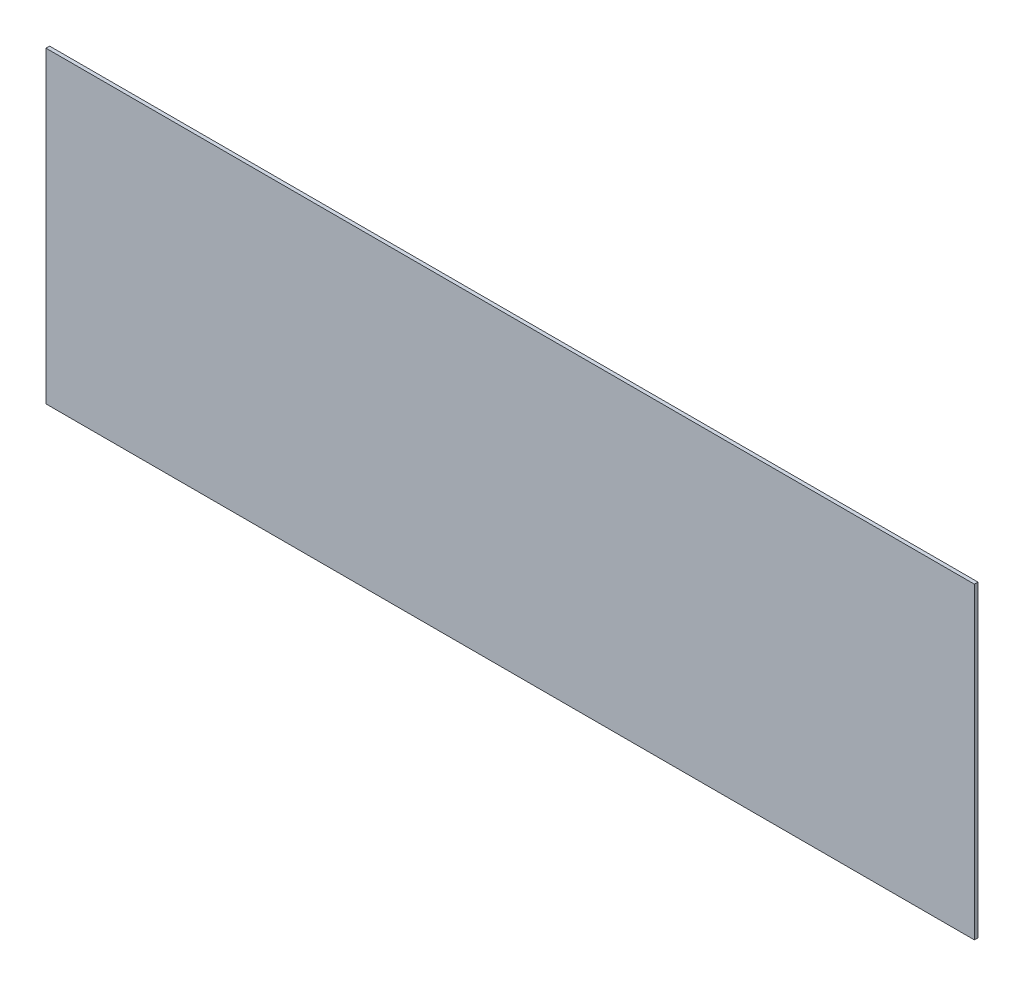
ISO-10303-21;
HEADER;
FILE_DESCRIPTION(('STEP AP214'),'2;1');
FILE_NAME('part.step','',(''),(''),'','','');
FILE_SCHEMA(('AUTOMOTIVE_DESIGN { 1 0 10303 214 1 1 1 1 }'));
ENDSEC;
DATA;
#1=APPLICATION_CONTEXT('core data for automotive mechanical design processes');
#2=APPLICATION_PROTOCOL_DEFINITION('international standard','automotive_design',2000,#1);
#3=PRODUCT_CONTEXT('',#1,'mechanical');
#4=PRODUCT('Part','Part','',(#3));
#5=PRODUCT_RELATED_PRODUCT_CATEGORY('part','',(#4));
#6=PRODUCT_DEFINITION_FORMATION('','',#4);
#7=PRODUCT_DEFINITION_CONTEXT('part definition',#1,'design');
#8=PRODUCT_DEFINITION('design','',#6,#7);
#9=PRODUCT_DEFINITION_SHAPE('','',#8);
#10=(LENGTH_UNIT() NAMED_UNIT(*) SI_UNIT(.MILLI.,.METRE.));
#11=(NAMED_UNIT(*) PLANE_ANGLE_UNIT() SI_UNIT($,.RADIAN.));
#12=(NAMED_UNIT(*) SI_UNIT($,.STERADIAN.) SOLID_ANGLE_UNIT());
#13=UNCERTAINTY_MEASURE_WITH_UNIT(LENGTH_MEASURE(1.E-05),#10,'distance_accuracy_value','');
#14=(GEOMETRIC_REPRESENTATION_CONTEXT(3) GLOBAL_UNCERTAINTY_ASSIGNED_CONTEXT((#13)) GLOBAL_UNIT_ASSIGNED_CONTEXT((#10,
#11,#12)) REPRESENTATION_CONTEXT('',''));
#15=CARTESIAN_POINT('',(0.,0.,0.));
#16=DIRECTION('',(0.,0.,1.));
#17=DIRECTION('',(1.,0.,0.));
#18=AXIS2_PLACEMENT_3D('',#15,#16,#17);
#19=CARTESIAN_POINT('',(189.884242312569,126.93436035502,2.));
#20=DIRECTION('',(-1.,0.,0.));
#21=DIRECTION('',(0.,-1.,0.));
#22=AXIS2_PLACEMENT_3D('',#19,#20,#21);
#23=PLANE('',#22);
#24=DIRECTION('',(0.,1.,0.));
#25=VECTOR('',#24,1.);
#26=CARTESIAN_POINT('',(189.884242312569,126.93436035502,0.));
#27=LINE('',#26,#25);
#28=CARTESIAN_POINT('',(189.884242312569,-43.3656396449801,0.));
#29=VERTEX_POINT('',#28);
#30=CARTESIAN_POINT('',(189.884242312569,126.93436035502,0.));
#31=VERTEX_POINT('',#30);
#32=EDGE_CURVE('E102',#29,#31,#27,.T.);
#33=ORIENTED_EDGE('',*,*,#32,.T.);
#34=DIRECTION('',(0.,0.,-1.));
#35=VECTOR('',#34,1.);
#36=CARTESIAN_POINT('',(189.884242312569,126.93436035502,2.));
#37=LINE('',#36,#35);
#38=CARTESIAN_POINT('',(189.884242312569,126.93436035502,2.));
#39=VERTEX_POINT('',#38);
#40=EDGE_CURVE('E11',#39,#31,#37,.T.);
#41=ORIENTED_EDGE('',*,*,#40,.F.);
#42=DIRECTION('',(0.,1.,0.));
#43=VECTOR('',#42,1.);
#44=CARTESIAN_POINT('',(189.884242312569,126.93436035502,2.));
#45=LINE('',#44,#43);
#46=CARTESIAN_POINT('',(189.884242312569,-43.3656396449801,2.));
#47=VERTEX_POINT('',#46);
#48=EDGE_CURVE('E90',#47,#39,#45,.T.);
#49=ORIENTED_EDGE('',*,*,#48,.F.);
#50=DIRECTION('',(0.,0.,-1.));
#51=VECTOR('',#50,1.);
#52=CARTESIAN_POINT('',(189.884242312569,-43.3656396449801,2.));
#53=LINE('',#52,#51);
#54=EDGE_CURVE('E98',#47,#29,#53,.T.);
#55=ORIENTED_EDGE('',*,*,#54,.T.);
#56=EDGE_LOOP('',(#33,#41,#49,#55));
#57=FACE_BOUND('',#56,.T.);
#58=ADVANCED_FACE('F39',(#57),#23,.F.);
#59=CARTESIAN_POINT('',(189.884242312569,126.93436035502,2.));
#60=DIRECTION('',(0.,-1.,0.));
#61=DIRECTION('',(0.,0.,-1.));
#62=AXIS2_PLACEMENT_3D('',#59,#60,#61);
#63=PLANE('',#62);
#64=DIRECTION('',(-1.,0.,0.));
#65=VECTOR('',#64,1.);
#66=CARTESIAN_POINT('',(189.884242312569,126.93436035502,0.));
#67=LINE('',#66,#65);
#68=CARTESIAN_POINT('',(-323.285757687431,126.93436035502,0.));
#69=VERTEX_POINT('',#68);
#70=EDGE_CURVE('E94',#31,#69,#67,.T.);
#71=ORIENTED_EDGE('',*,*,#70,.T.);
#72=DIRECTION('',(0.,0.,-1.));
#73=VECTOR('',#72,1.);
#74=CARTESIAN_POINT('',(-323.285757687431,126.93436035502,2.));
#75=LINE('',#74,#73);
#76=CARTESIAN_POINT('',(-323.285757687431,126.93436035502,2.));
#77=VERTEX_POINT('',#76);
#78=EDGE_CURVE('E47',#77,#69,#75,.T.);
#79=ORIENTED_EDGE('',*,*,#78,.F.);
#80=DIRECTION('',(-1.,0.,0.));
#81=VECTOR('',#80,1.);
#82=CARTESIAN_POINT('',(189.884242312569,126.93436035502,2.));
#83=LINE('',#82,#81);
#84=EDGE_CURVE('E85',#39,#77,#83,.T.);
#85=ORIENTED_EDGE('',*,*,#84,.F.);
#86=ORIENTED_EDGE('',*,*,#40,.T.);
#87=EDGE_LOOP('',(#71,#79,#85,#86));
#88=FACE_BOUND('',#87,.T.);
#89=ADVANCED_FACE('F93',(#88),#63,.F.);
#90=CARTESIAN_POINT('',(-323.285757687431,126.93436035502,2.));
#91=DIRECTION('',(1.,0.,0.));
#92=DIRECTION('',(0.,1.,0.));
#93=AXIS2_PLACEMENT_3D('',#90,#91,#92);
#94=PLANE('',#93);
#95=DIRECTION('',(0.,-1.,0.));
#96=VECTOR('',#95,1.);
#97=CARTESIAN_POINT('',(-323.285757687431,126.93436035502,0.));
#98=LINE('',#97,#96);
#99=CARTESIAN_POINT('',(-323.285757687431,-43.3656396449802,0.));
#100=VERTEX_POINT('',#99);
#101=EDGE_CURVE('E72',#69,#100,#98,.T.);
#102=ORIENTED_EDGE('',*,*,#101,.T.);
#103=DIRECTION('',(0.,0.,-1.));
#104=VECTOR('',#103,1.);
#105=CARTESIAN_POINT('',(-323.285757687431,-43.3656396449802,2.));
#106=LINE('',#105,#104);
#107=CARTESIAN_POINT('',(-323.285757687431,-43.3656396449802,2.));
#108=VERTEX_POINT('',#107);
#109=EDGE_CURVE('E95',#108,#100,#106,.T.);
#110=ORIENTED_EDGE('',*,*,#109,.F.);
#111=DIRECTION('',(0.,-1.,0.));
#112=VECTOR('',#111,1.);
#113=CARTESIAN_POINT('',(-323.285757687431,126.93436035502,2.));
#114=LINE('',#113,#112);
#115=EDGE_CURVE('E88',#77,#108,#114,.T.);
#116=ORIENTED_EDGE('',*,*,#115,.F.);
#117=ORIENTED_EDGE('',*,*,#78,.T.);
#118=EDGE_LOOP('',(#102,#110,#116,#117));
#119=FACE_BOUND('',#118,.T.);
#120=ADVANCED_FACE('F96',(#119),#94,.F.);
#121=CARTESIAN_POINT('',(189.884242312569,-43.3656396449801,2.));
#122=DIRECTION('',(0.,1.,0.));
#123=DIRECTION('',(-1.,0.,0.));
#124=AXIS2_PLACEMENT_3D('',#121,#122,#123);
#125=PLANE('',#124);
#126=DIRECTION('',(1.,0.,0.));
#127=VECTOR('',#126,1.);
#128=CARTESIAN_POINT('',(189.884242312569,-43.3656396449801,0.));
#129=LINE('',#128,#127);
#130=EDGE_CURVE('E78',#100,#29,#129,.T.);
#131=ORIENTED_EDGE('',*,*,#130,.T.);
#132=ORIENTED_EDGE('',*,*,#54,.F.);
#133=DIRECTION('',(1.,0.,0.));
#134=VECTOR('',#133,1.);
#135=CARTESIAN_POINT('',(189.884242312569,-43.3656396449801,2.));
#136=LINE('',#135,#134);
#137=EDGE_CURVE('E55',#108,#47,#136,.T.);
#138=ORIENTED_EDGE('',*,*,#137,.F.);
#139=ORIENTED_EDGE('',*,*,#109,.T.);
#140=EDGE_LOOP('',(#131,#132,#138,#139));
#141=FACE_BOUND('',#140,.T.);
#142=ADVANCED_FACE('F109',(#141),#125,.F.);
#143=CARTESIAN_POINT('',(0.,0.,2.));
#144=DIRECTION('',(0.,0.,-1.));
#145=DIRECTION('',(-1.,0.,0.));
#146=AXIS2_PLACEMENT_3D('',#143,#144,#145);
#147=PLANE('',#146);
#148=ORIENTED_EDGE('',*,*,#48,.T.);
#149=ORIENTED_EDGE('',*,*,#84,.T.);
#150=ORIENTED_EDGE('',*,*,#115,.T.);
#151=ORIENTED_EDGE('',*,*,#137,.T.);
#152=EDGE_LOOP('',(#148,#149,#150,#151));
#153=FACE_BOUND('',#152,.T.);
#154=ADVANCED_FACE('F86',(#153),#147,.F.);
#155=CARTESIAN_POINT('',(0.,0.,0.));
#156=DIRECTION('',(0.,0.,-1.));
#157=DIRECTION('',(-1.,0.,0.));
#158=AXIS2_PLACEMENT_3D('',#155,#156,#157);
#159=PLANE('',#158);
#160=ORIENTED_EDGE('',*,*,#32,.F.);
#161=ORIENTED_EDGE('',*,*,#130,.F.);
#162=ORIENTED_EDGE('',*,*,#101,.F.);
#163=ORIENTED_EDGE('',*,*,#70,.F.);
#164=EDGE_LOOP('',(#160,#161,#162,#163));
#165=FACE_BOUND('',#164,.T.);
#166=ADVANCED_FACE('F112',(#165),#159,.T.);
#167=CLOSED_SHELL('',(#58,#89,#120,#142,#154,#166));
#168=MANIFOLD_SOLID_BREP('B2',#167);
#169=ADVANCED_BREP_SHAPE_REPRESENTATION('',(#18,#168),#14);
#170=SHAPE_DEFINITION_REPRESENTATION(#9,#169);
ENDSEC;
END-ISO-10303-21;
